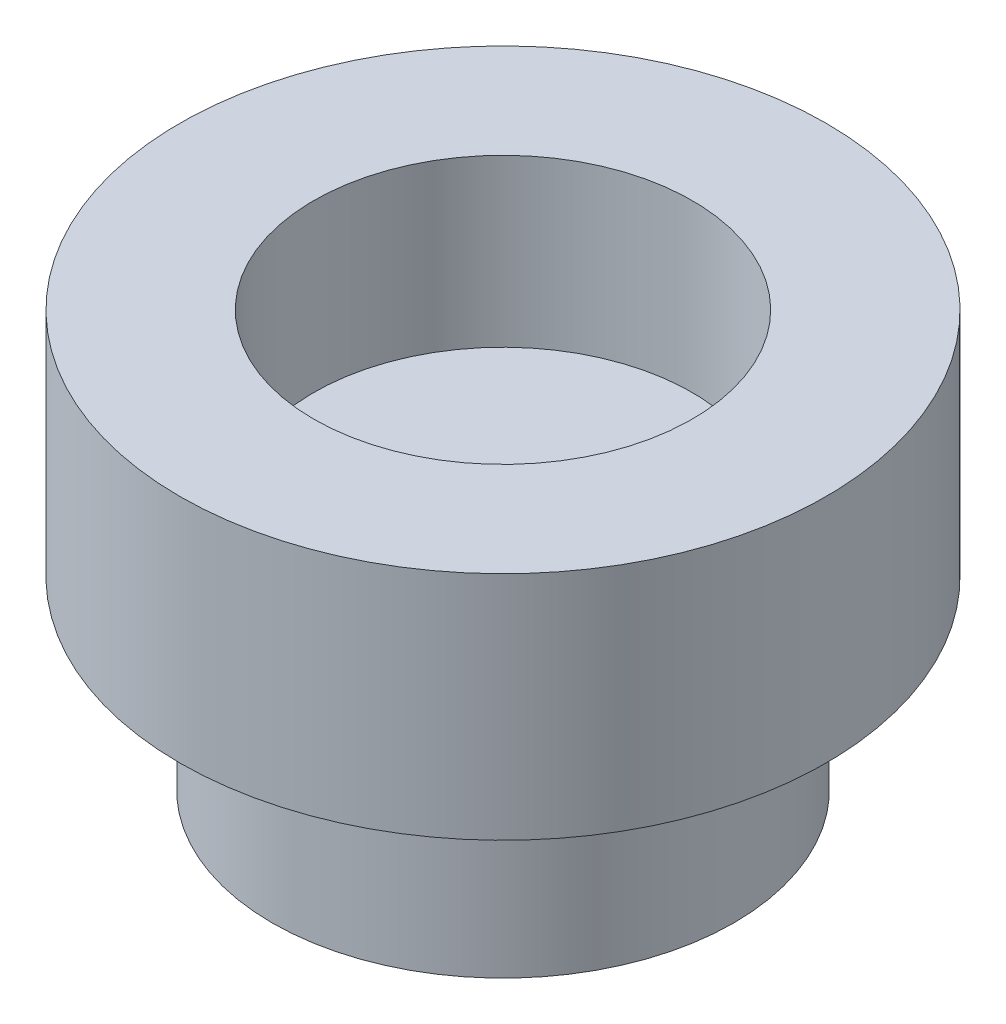
ISO-10303-21;
HEADER;
FILE_DESCRIPTION(('STEP AP214'),'2;1');
FILE_NAME('part.step','',(''),(''),'','','');
FILE_SCHEMA(('AUTOMOTIVE_DESIGN { 1 0 10303 214 1 1 1 1 }'));
ENDSEC;
DATA;
#1=APPLICATION_CONTEXT('core data for automotive mechanical design processes');
#2=APPLICATION_PROTOCOL_DEFINITION('international standard','automotive_design',2000,#1);
#3=PRODUCT_CONTEXT('',#1,'mechanical');
#4=PRODUCT('Part','Part','',(#3));
#5=PRODUCT_RELATED_PRODUCT_CATEGORY('part','',(#4));
#6=PRODUCT_DEFINITION_FORMATION('','',#4);
#7=PRODUCT_DEFINITION_CONTEXT('part definition',#1,'design');
#8=PRODUCT_DEFINITION('design','',#6,#7);
#9=PRODUCT_DEFINITION_SHAPE('','',#8);
#10=(LENGTH_UNIT() NAMED_UNIT(*) SI_UNIT(.MILLI.,.METRE.));
#11=(NAMED_UNIT(*) PLANE_ANGLE_UNIT() SI_UNIT($,.RADIAN.));
#12=(NAMED_UNIT(*) SI_UNIT($,.STERADIAN.) SOLID_ANGLE_UNIT());
#13=UNCERTAINTY_MEASURE_WITH_UNIT(LENGTH_MEASURE(1.E-05),#10,'distance_accuracy_value','');
#14=(GEOMETRIC_REPRESENTATION_CONTEXT(3) GLOBAL_UNCERTAINTY_ASSIGNED_CONTEXT((#13)) GLOBAL_UNIT_ASSIGNED_CONTEXT((#10,
#11,#12)) REPRESENTATION_CONTEXT('',''));
#15=CARTESIAN_POINT('',(0.,0.,0.));
#16=DIRECTION('',(0.,0.,1.));
#17=DIRECTION('',(1.,0.,0.));
#18=AXIS2_PLACEMENT_3D('',#15,#16,#17);
#19=CARTESIAN_POINT('',(0.,4.5,0.));
#20=DIRECTION('',(0.,1.,0.));
#21=DIRECTION('',(0.,0.,1.));
#22=AXIS2_PLACEMENT_3D('',#19,#20,#21);
#23=PLANE('',#22);
#24=CARTESIAN_POINT('',(0.,4.5,0.));
#25=DIRECTION('',(0.,1.,0.));
#26=DIRECTION('',(0.,0.,1.));
#27=AXIS2_PLACEMENT_3D('',#24,#25,#26);
#28=CIRCLE('',#27,2.05);
#29=CARTESIAN_POINT('',(0.,4.5,2.05));
#30=VERTEX_POINT('',#29);
#31=EDGE_CURVE('E68',#30,#30,#28,.T.);
#32=ORIENTED_EDGE('',*,*,#31,.F.);
#33=EDGE_LOOP('',(#32));
#34=FACE_BOUND('',#33,.T.);
#35=CARTESIAN_POINT('',(0.,4.5,0.));
#36=DIRECTION('',(0.,1.,0.));
#37=DIRECTION('',(0.,0.,1.));
#38=AXIS2_PLACEMENT_3D('',#35,#36,#37);
#39=CIRCLE('',#38,3.5);
#40=CARTESIAN_POINT('',(0.,4.5,3.5));
#41=VERTEX_POINT('',#40);
#42=EDGE_CURVE('E10',#41,#41,#39,.T.);
#43=ORIENTED_EDGE('',*,*,#42,.T.);
#44=EDGE_LOOP('',(#43));
#45=FACE_BOUND('',#44,.T.);
#46=ADVANCED_FACE('F39',(#34,#45),#23,.T.);
#47=CARTESIAN_POINT('',(0.,14.3994949366117,0.));
#48=DIRECTION('',(0.,-1.,0.));
#49=DIRECTION('',(0.,0.,-1.));
#50=AXIS2_PLACEMENT_3D('',#47,#48,#49);
#51=CYLINDRICAL_SURFACE('',#50,3.5);
#52=CARTESIAN_POINT('',(0.,2.,0.));
#53=DIRECTION('',(0.,1.,0.));
#54=DIRECTION('',(0.,0.,1.));
#55=AXIS2_PLACEMENT_3D('',#52,#53,#54);
#56=CIRCLE('',#55,3.5);
#57=CARTESIAN_POINT('',(0.,2.,3.5));
#58=VERTEX_POINT('',#57);
#59=EDGE_CURVE('E47',#58,#58,#56,.T.);
#60=ORIENTED_EDGE('',*,*,#59,.T.);
#61=EDGE_LOOP('',(#60));
#62=FACE_BOUND('',#61,.T.);
#63=ORIENTED_EDGE('',*,*,#42,.F.);
#64=EDGE_LOOP('',(#63));
#65=FACE_BOUND('',#64,.T.);
#66=ADVANCED_FACE('F79',(#62,#65),#51,.T.);
#67=CARTESIAN_POINT('',(0.,2.,0.));
#68=DIRECTION('',(0.,-1.,0.));
#69=DIRECTION('',(0.,0.,-1.));
#70=AXIS2_PLACEMENT_3D('',#67,#68,#69);
#71=CYLINDRICAL_SURFACE('',#70,2.5);
#72=CARTESIAN_POINT('',(0.,2.,0.));
#73=DIRECTION('',(0.,1.,0.));
#74=DIRECTION('',(0.,0.,1.));
#75=AXIS2_PLACEMENT_3D('',#72,#73,#74);
#76=CIRCLE('',#75,2.5);
#77=CARTESIAN_POINT('',(0.,2.,2.5));
#78=VERTEX_POINT('',#77);
#79=EDGE_CURVE('E52',#78,#78,#76,.T.);
#80=ORIENTED_EDGE('',*,*,#79,.F.);
#81=EDGE_LOOP('',(#80));
#82=FACE_BOUND('',#81,.T.);
#83=CARTESIAN_POINT('',(0.,0.,0.));
#84=DIRECTION('',(0.,1.,0.));
#85=DIRECTION('',(0.,0.,1.));
#86=AXIS2_PLACEMENT_3D('',#83,#84,#85);
#87=CIRCLE('',#86,2.5);
#88=CARTESIAN_POINT('',(0.,0.,2.5));
#89=VERTEX_POINT('',#88);
#90=EDGE_CURVE('E58',#89,#89,#87,.T.);
#91=ORIENTED_EDGE('',*,*,#90,.T.);
#92=EDGE_LOOP('',(#91));
#93=FACE_BOUND('',#92,.T.);
#94=ADVANCED_FACE('F83',(#82,#93),#71,.T.);
#95=CARTESIAN_POINT('',(0.,2.,0.));
#96=DIRECTION('',(0.,1.,0.));
#97=DIRECTION('',(0.,0.,1.));
#98=AXIS2_PLACEMENT_3D('',#95,#96,#97);
#99=PLANE('',#98);
#100=ORIENTED_EDGE('',*,*,#79,.T.);
#101=EDGE_LOOP('',(#100));
#102=FACE_BOUND('',#101,.T.);
#103=ORIENTED_EDGE('',*,*,#59,.F.);
#104=EDGE_LOOP('',(#103));
#105=FACE_BOUND('',#104,.T.);
#106=ADVANCED_FACE('F88',(#102,#105),#99,.F.);
#107=CARTESIAN_POINT('',(0.,0.,0.));
#108=DIRECTION('',(0.,1.,0.));
#109=DIRECTION('',(0.,0.,1.));
#110=AXIS2_PLACEMENT_3D('',#107,#108,#109);
#111=PLANE('',#110);
#112=ORIENTED_EDGE('',*,*,#90,.F.);
#113=EDGE_LOOP('',(#112));
#114=FACE_BOUND('',#113,.T.);
#115=ADVANCED_FACE('F41',(#114),#111,.F.);
#116=CARTESIAN_POINT('',(0.,2.7,0.));
#117=DIRECTION('',(0.,1.,0.));
#118=DIRECTION('',(0.,0.,1.));
#119=AXIS2_PLACEMENT_3D('',#116,#117,#118);
#120=CYLINDRICAL_SURFACE('',#119,2.05);
#121=CARTESIAN_POINT('',(0.,2.7,0.));
#122=DIRECTION('',(0.,1.,0.));
#123=DIRECTION('',(0.,0.,1.));
#124=AXIS2_PLACEMENT_3D('',#121,#122,#123);
#125=CIRCLE('',#124,2.05);
#126=CARTESIAN_POINT('',(0.,2.7,2.05));
#127=VERTEX_POINT('',#126);
#128=EDGE_CURVE('E63',#127,#127,#125,.T.);
#129=ORIENTED_EDGE('',*,*,#128,.F.);
#130=EDGE_LOOP('',(#129));
#131=FACE_BOUND('',#130,.T.);
#132=ORIENTED_EDGE('',*,*,#31,.T.);
#133=EDGE_LOOP('',(#132));
#134=FACE_BOUND('',#133,.T.);
#135=ADVANCED_FACE('F76',(#131,#134),#120,.F.);
#136=CARTESIAN_POINT('',(0.,2.7,0.));
#137=DIRECTION('',(0.,1.,0.));
#138=DIRECTION('',(0.,0.,1.));
#139=AXIS2_PLACEMENT_3D('',#136,#137,#138);
#140=PLANE('',#139);
#141=ORIENTED_EDGE('',*,*,#128,.T.);
#142=EDGE_LOOP('',(#141));
#143=FACE_BOUND('',#142,.T.);
#144=ADVANCED_FACE('F95',(#143),#140,.T.);
#145=CLOSED_SHELL('',(#46,#66,#94,#106,#115,#135,#144));
#146=MANIFOLD_SOLID_BREP('B2',#145);
#147=ADVANCED_BREP_SHAPE_REPRESENTATION('',(#18,#146),#14);
#148=SHAPE_DEFINITION_REPRESENTATION(#9,#147);
ENDSEC;
END-ISO-10303-21;
